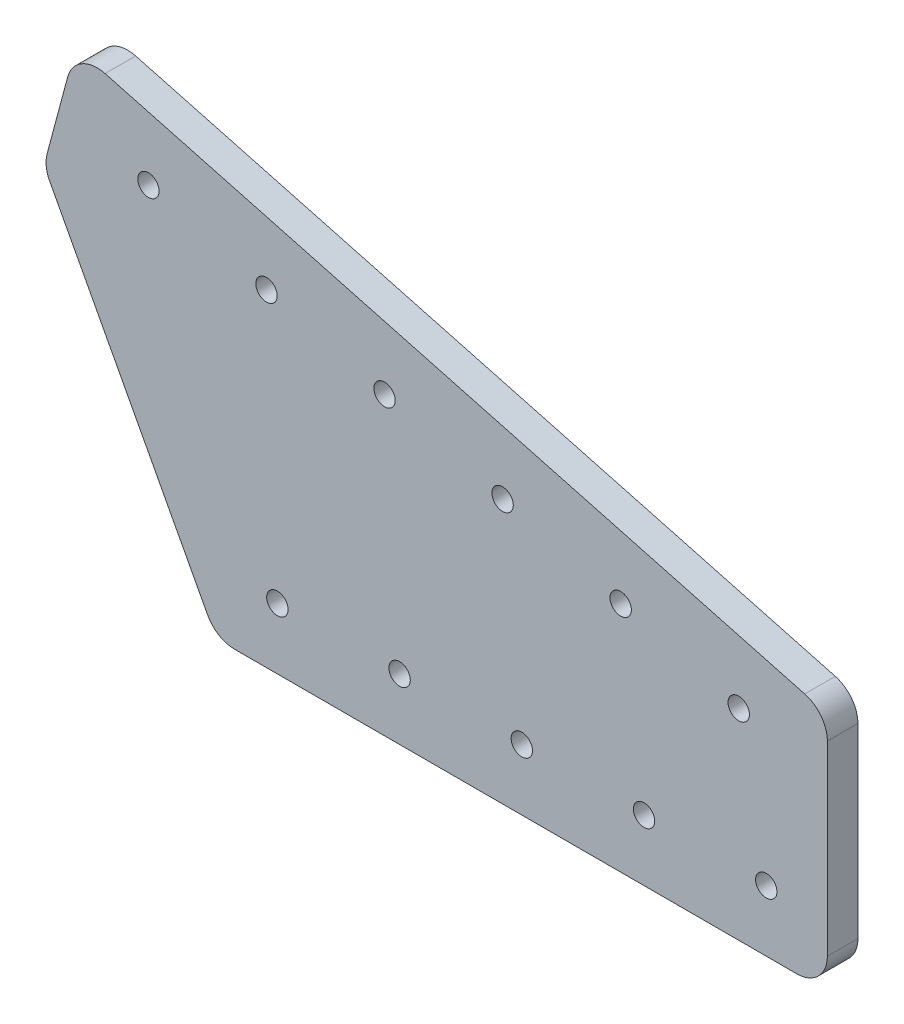
ISO-10303-21;
HEADER;
FILE_DESCRIPTION(('STEP AP214'),'2;1');
FILE_NAME('part.step','',(''),(''),'','','');
FILE_SCHEMA(('AUTOMOTIVE_DESIGN { 1 0 10303 214 1 1 1 1 }'));
ENDSEC;
DATA;
#1=APPLICATION_CONTEXT('core data for automotive mechanical design processes');
#2=APPLICATION_PROTOCOL_DEFINITION('international standard','automotive_design',2000,#1);
#3=PRODUCT_CONTEXT('',#1,'mechanical');
#4=PRODUCT('Part','Part','',(#3));
#5=PRODUCT_RELATED_PRODUCT_CATEGORY('part','',(#4));
#6=PRODUCT_DEFINITION_FORMATION('','',#4);
#7=PRODUCT_DEFINITION_CONTEXT('part definition',#1,'design');
#8=PRODUCT_DEFINITION('design','',#6,#7);
#9=PRODUCT_DEFINITION_SHAPE('','',#8);
#10=(LENGTH_UNIT() NAMED_UNIT(*) SI_UNIT(.MILLI.,.METRE.));
#11=(NAMED_UNIT(*) PLANE_ANGLE_UNIT() SI_UNIT($,.RADIAN.));
#12=(NAMED_UNIT(*) SI_UNIT($,.STERADIAN.) SOLID_ANGLE_UNIT());
#13=UNCERTAINTY_MEASURE_WITH_UNIT(LENGTH_MEASURE(1.E-05),#10,'distance_accuracy_value','');
#14=(GEOMETRIC_REPRESENTATION_CONTEXT(3) GLOBAL_UNCERTAINTY_ASSIGNED_CONTEXT((#13)) GLOBAL_UNIT_ASSIGNED_CONTEXT((#10,
#11,#12)) REPRESENTATION_CONTEXT('',''));
#15=CARTESIAN_POINT('',(0.,0.,0.));
#16=DIRECTION('',(0.,0.,1.));
#17=DIRECTION('',(1.,0.,0.));
#18=AXIS2_PLACEMENT_3D('',#15,#16,#17);
#19=CARTESIAN_POINT('',(200.,0.,10.));
#20=DIRECTION('',(0.,1.,0.));
#21=DIRECTION('',(-1.,0.,0.));
#22=AXIS2_PLACEMENT_3D('',#19,#20,#21);
#23=PLANE('',#22);
#24=DIRECTION('',(1.,0.,0.));
#25=VECTOR('',#24,1.);
#26=CARTESIAN_POINT('',(200.,0.,10.));
#27=LINE('',#26,#25);
#28=CARTESIAN_POINT('',(6.00519056041624,0.,10.));
#29=VERTEX_POINT('',#28);
#30=CARTESIAN_POINT('',(190.,0.,10.));
#31=VERTEX_POINT('',#30);
#32=EDGE_CURVE('E145',#29,#31,#27,.T.);
#33=ORIENTED_EDGE('',*,*,#32,.F.);
#34=DIRECTION('',(0.,0.,-1.));
#35=VECTOR('',#34,1.);
#36=CARTESIAN_POINT('',(6.00519056041624,0.,10.));
#37=LINE('',#36,#35);
#38=CARTESIAN_POINT('',(6.00519056041624,0.,0.));
#39=VERTEX_POINT('',#38);
#40=EDGE_CURVE('E130',#29,#39,#37,.T.);
#41=ORIENTED_EDGE('',*,*,#40,.T.);
#42=DIRECTION('',(1.,0.,0.));
#43=VECTOR('',#42,1.);
#44=CARTESIAN_POINT('',(200.,0.,0.));
#45=LINE('',#44,#43);
#46=CARTESIAN_POINT('',(190.,0.,0.));
#47=VERTEX_POINT('',#46);
#48=EDGE_CURVE('E142',#39,#47,#45,.T.);
#49=ORIENTED_EDGE('',*,*,#48,.T.);
#50=DIRECTION('',(0.,0.,-1.));
#51=VECTOR('',#50,1.);
#52=CARTESIAN_POINT('',(190.,0.,10.));
#53=LINE('',#52,#51);
#54=EDGE_CURVE('E147',#47,#31,#53,.F.);
#55=ORIENTED_EDGE('',*,*,#54,.T.);
#56=EDGE_LOOP('',(#33,#41,#49,#55));
#57=FACE_BOUND('',#56,.T.);
#58=ADVANCED_FACE('F48',(#57),#23,.F.);
#59=CARTESIAN_POINT('',(200.,78.6370330515628,10.));
#60=DIRECTION('',(-1.,0.,0.));
#61=DIRECTION('',(0.,0.,1.));
#62=AXIS2_PLACEMENT_3D('',#59,#60,#61);
#63=PLANE('',#62);
#64=DIRECTION('',(0.,1.,0.));
#65=VECTOR('',#64,1.);
#66=CARTESIAN_POINT('',(200.,78.6370330515628,10.));
#67=LINE('',#66,#65);
#68=CARTESIAN_POINT('',(200.,10.,10.));
#69=VERTEX_POINT('',#68);
#70=CARTESIAN_POINT('',(200.,70.9637631717731,10.));
#71=VERTEX_POINT('',#70);
#72=EDGE_CURVE('E215',#69,#71,#67,.T.);
#73=ORIENTED_EDGE('',*,*,#72,.F.);
#74=DIRECTION('',(0.,0.,-1.));
#75=VECTOR('',#74,1.);
#76=CARTESIAN_POINT('',(200.,10.,10.));
#77=LINE('',#76,#75);
#78=CARTESIAN_POINT('',(200.,10.,0.));
#79=VERTEX_POINT('',#78);
#80=EDGE_CURVE('E191',#69,#79,#77,.T.);
#81=ORIENTED_EDGE('',*,*,#80,.T.);
#82=DIRECTION('',(0.,1.,0.));
#83=VECTOR('',#82,1.);
#84=CARTESIAN_POINT('',(200.,78.6370330515628,0.));
#85=LINE('',#84,#83);
#86=CARTESIAN_POINT('',(200.,70.9637631717731,0.));
#87=VERTEX_POINT('',#86);
#88=EDGE_CURVE('E151',#79,#87,#85,.T.);
#89=ORIENTED_EDGE('',*,*,#88,.T.);
#90=DIRECTION('',(0.,0.,-1.));
#91=VECTOR('',#90,1.);
#92=CARTESIAN_POINT('',(200.,70.9637631717731,10.));
#93=LINE('',#92,#91);
#94=EDGE_CURVE('E189',#87,#71,#93,.F.);
#95=ORIENTED_EDGE('',*,*,#94,.T.);
#96=EDGE_LOOP('',(#73,#81,#89,#95));
#97=FACE_BOUND('',#96,.T.);
#98=ADVANCED_FACE('F298',(#97),#63,.F.);
#99=CARTESIAN_POINT('',(-46.0370066276877,144.562450285621,10.));
#100=DIRECTION('',(-0.258819045102515,-0.96592582628907,0.));
#101=DIRECTION('',(0.96592582628907,-0.258819045102515,0.));
#102=AXIS2_PLACEMENT_3D('',#99,#100,#101);
#103=PLANE('',#102);
#104=DIRECTION('',(-0.96592582628907,0.258819045102515,0.));
#105=VECTOR('',#104,1.);
#106=CARTESIAN_POINT('',(-46.0370066276877,144.562450285621,10.));
#107=LINE('',#106,#105);
#108=CARTESIAN_POINT('',(192.588190451025,80.6230214346638,10.));
#109=VERTEX_POINT('',#108);
#110=CARTESIAN_POINT('',(-36.377748364797,141.974259834596,10.));
#111=VERTEX_POINT('',#110);
#112=EDGE_CURVE('E204',#109,#111,#107,.T.);
#113=ORIENTED_EDGE('',*,*,#112,.F.);
#114=DIRECTION('',(0.,0.,-1.));
#115=VECTOR('',#114,1.);
#116=CARTESIAN_POINT('',(192.588190451025,80.6230214346638,10.));
#117=LINE('',#116,#115);
#118=CARTESIAN_POINT('',(192.588190451025,80.6230214346638,0.));
#119=VERTEX_POINT('',#118);
#120=EDGE_CURVE('E196',#109,#119,#117,.T.);
#121=ORIENTED_EDGE('',*,*,#120,.T.);
#122=DIRECTION('',(-0.96592582628907,0.258819045102515,0.));
#123=VECTOR('',#122,1.);
#124=CARTESIAN_POINT('',(-46.0370066276877,144.562450285621,0.));
#125=LINE('',#124,#123);
#126=CARTESIAN_POINT('',(-36.377748364797,141.974259834596,0.));
#127=VERTEX_POINT('',#126);
#128=EDGE_CURVE('E155',#119,#127,#125,.T.);
#129=ORIENTED_EDGE('',*,*,#128,.T.);
#130=DIRECTION('',(0.,0.,-1.));
#131=VECTOR('',#130,1.);
#132=CARTESIAN_POINT('',(-36.377748364797,141.974259834596,10.));
#133=LINE('',#132,#131);
#134=EDGE_CURVE('E194',#127,#111,#133,.F.);
#135=ORIENTED_EDGE('',*,*,#134,.T.);
#136=EDGE_LOOP('',(#113,#121,#129,#135));
#137=FACE_BOUND('',#136,.T.);
#138=ADVANCED_FACE('F202',(#137),#103,.F.);
#139=CARTESIAN_POINT('',(-56.3897684317884,105.925417234058,10.));
#140=DIRECTION('',(0.965925826289069,-0.258819045102518,0.));
#141=DIRECTION('',(0.258819045102518,0.965925826289069,0.));
#142=AXIS2_PLACEMENT_3D('',#139,#140,#141);
#143=PLANE('',#142);
#144=DIRECTION('',(-0.258819045102518,-0.965925826289069,0.));
#145=VECTOR('',#144,1.);
#146=CARTESIAN_POINT('',(-56.3897684317884,105.925417234058,10.));
#147=LINE('',#146,#145);
#148=CARTESIAN_POINT('',(-48.6251970787128,134.90319202273,10.));
#149=VERTEX_POINT('',#148);
#150=CARTESIAN_POINT('',(-55.3695025999747,109.733101155613,10.));
#151=VERTEX_POINT('',#150);
#152=EDGE_CURVE('E212',#149,#151,#147,.T.);
#153=ORIENTED_EDGE('',*,*,#152,.F.);
#154=DIRECTION('',(0.,0.,-1.));
#155=VECTOR('',#154,1.);
#156=CARTESIAN_POINT('',(-48.6251970787128,134.90319202273,10.));
#157=LINE('',#156,#155);
#158=CARTESIAN_POINT('',(-48.6251970787128,134.90319202273,0.));
#159=VERTEX_POINT('',#158);
#160=EDGE_CURVE('E12',#149,#159,#157,.T.);
#161=ORIENTED_EDGE('',*,*,#160,.T.);
#162=DIRECTION('',(-0.258819045102518,-0.965925826289069,0.));
#163=VECTOR('',#162,1.);
#164=CARTESIAN_POINT('',(-56.3897684317884,105.925417234058,0.));
#165=LINE('',#164,#163);
#166=CARTESIAN_POINT('',(-55.3695025999747,109.733101155613,0.));
#167=VERTEX_POINT('',#166);
#168=EDGE_CURVE('E166',#159,#167,#165,.T.);
#169=ORIENTED_EDGE('',*,*,#168,.T.);
#170=DIRECTION('',(0.,0.,-1.));
#171=VECTOR('',#170,1.);
#172=CARTESIAN_POINT('',(-55.3695025999747,109.733101155613,10.));
#173=LINE('',#172,#171);
#174=EDGE_CURVE('E56',#167,#151,#173,.F.);
#175=ORIENTED_EDGE('',*,*,#174,.T.);
#176=EDGE_LOOP('',(#153,#161,#169,#175));
#177=FACE_BOUND('',#176,.T.);
#178=ADVANCED_FACE('F211',(#177),#143,.F.);
#179=CARTESIAN_POINT('',(0.,0.,10.));
#180=DIRECTION('',(0.882711810283817,0.46991473693157,0.));
#181=DIRECTION('',(-0.46991473693157,0.882711810283817,0.));
#182=AXIS2_PLACEMENT_3D('',#179,#180,#181);
#183=PLANE('',#182);
#184=DIRECTION('',(0.46991473693157,-0.882711810283817,0.));
#185=VECTOR('',#184,1.);
#186=CARTESIAN_POINT('',(0.,0.,0.));
#187=LINE('',#186,#185);
#188=CARTESIAN_POINT('',(-54.5373624399222,102.445763335272,0.));
#189=VERTEX_POINT('',#188);
#190=CARTESIAN_POINT('',(-2.82192754242194,5.3008526306843,0.));
#191=VERTEX_POINT('',#190);
#192=EDGE_CURVE('E168',#189,#191,#187,.T.);
#193=ORIENTED_EDGE('',*,*,#192,.T.);
#194=DIRECTION('',(0.,0.,-1.));
#195=VECTOR('',#194,1.);
#196=CARTESIAN_POINT('',(-2.82192754242194,5.3008526306843,10.));
#197=LINE('',#196,#195);
#198=CARTESIAN_POINT('',(-2.82192754242194,5.3008526306843,10.));
#199=VERTEX_POINT('',#198);
#200=EDGE_CURVE('E131',#191,#199,#197,.F.);
#201=ORIENTED_EDGE('',*,*,#200,.T.);
#202=DIRECTION('',(0.46991473693157,-0.882711810283817,0.));
#203=VECTOR('',#202,1.);
#204=CARTESIAN_POINT('',(0.,0.,10.));
#205=LINE('',#204,#203);
#206=CARTESIAN_POINT('',(-54.5373624399222,102.445763335272,10.));
#207=VERTEX_POINT('',#206);
#208=EDGE_CURVE('E161',#207,#199,#205,.T.);
#209=ORIENTED_EDGE('',*,*,#208,.F.);
#210=DIRECTION('',(0.,0.,-1.));
#211=VECTOR('',#210,1.);
#212=CARTESIAN_POINT('',(-54.5373624399222,102.445763335272,10.));
#213=LINE('',#212,#211);
#214=EDGE_CURVE('E136',#207,#189,#213,.T.);
#215=ORIENTED_EDGE('',*,*,#214,.T.);
#216=EDGE_LOOP('',(#193,#201,#209,#215));
#217=FACE_BOUND('',#216,.T.);
#218=ADVANCED_FACE('F331',(#217),#183,.F.);
#219=CARTESIAN_POINT('',(0.,0.,10.));
#220=DIRECTION('',(0.,0.,1.));
#221=DIRECTION('',(1.,0.,0.));
#222=AXIS2_PLACEMENT_3D('',#219,#220,#221);
#223=PLANE('',#222);
#224=CARTESIAN_POINT('',(16.4377566577868,107.116864307751,10.));
#225=DIRECTION('',(0.,0.,1.));
#226=DIRECTION('',(1.,0.,0.));
#227=AXIS2_PLACEMENT_3D('',#224,#225,#226);
#228=CIRCLE('',#227,3.5);
#229=CARTESIAN_POINT('',(19.9377566577868,107.116864307751,10.));
#230=VERTEX_POINT('',#229);
#231=EDGE_CURVE('E223',#230,#230,#228,.T.);
#232=ORIENTED_EDGE('',*,*,#231,.F.);
#233=EDGE_LOOP('',(#232));
#234=FACE_BOUND('',#233,.T.);
#235=CARTESIAN_POINT('',(55.0747897093496,96.7641025036506,10.));
#236=DIRECTION('',(0.,0.,1.));
#237=DIRECTION('',(1.,0.,0.));
#238=AXIS2_PLACEMENT_3D('',#235,#236,#237);
#239=CIRCLE('',#238,3.5);
#240=CARTESIAN_POINT('',(58.5747897093496,96.7641025036506,10.));
#241=VERTEX_POINT('',#240);
#242=EDGE_CURVE('E226',#241,#241,#239,.T.);
#243=ORIENTED_EDGE('',*,*,#242,.F.);
#244=EDGE_LOOP('',(#243));
#245=FACE_BOUND('',#244,.T.);
#246=CARTESIAN_POINT('',(93.7118227609124,86.41134069955,10.));
#247=DIRECTION('',(0.,0.,1.));
#248=DIRECTION('',(1.,0.,0.));
#249=AXIS2_PLACEMENT_3D('',#246,#247,#248);
#250=CIRCLE('',#249,3.5);
#251=CARTESIAN_POINT('',(97.2118227609124,86.41134069955,10.));
#252=VERTEX_POINT('',#251);
#253=EDGE_CURVE('E229',#252,#252,#250,.T.);
#254=ORIENTED_EDGE('',*,*,#253,.F.);
#255=EDGE_LOOP('',(#254));
#256=FACE_BOUND('',#255,.T.);
#257=CARTESIAN_POINT('',(132.348855812475,76.0585788954492,10.));
#258=DIRECTION('',(0.,0.,1.));
#259=DIRECTION('',(1.,0.,0.));
#260=AXIS2_PLACEMENT_3D('',#257,#258,#259);
#261=CIRCLE('',#260,3.5);
#262=CARTESIAN_POINT('',(135.848855812475,76.0585788954492,10.));
#263=VERTEX_POINT('',#262);
#264=EDGE_CURVE('E232',#263,#263,#261,.T.);
#265=ORIENTED_EDGE('',*,*,#264,.F.);
#266=EDGE_LOOP('',(#265));
#267=FACE_BOUND('',#266,.T.);
#268=CARTESIAN_POINT('',(170.985888864038,65.7058170913485,10.));
#269=DIRECTION('',(0.,0.,1.));
#270=DIRECTION('',(1.,0.,0.));
#271=AXIS2_PLACEMENT_3D('',#268,#269,#270);
#272=CIRCLE('',#271,3.5);
#273=CARTESIAN_POINT('',(174.485888864038,65.7058170913485,10.));
#274=VERTEX_POINT('',#273);
#275=EDGE_CURVE('E235',#274,#274,#272,.T.);
#276=ORIENTED_EDGE('',*,*,#275,.F.);
#277=EDGE_LOOP('',(#276));
#278=FACE_BOUND('',#277,.T.);
#279=CARTESIAN_POINT('',(20.,20.,10.));
#280=DIRECTION('',(0.,0.,1.));
#281=DIRECTION('',(1.,0.,0.));
#282=AXIS2_PLACEMENT_3D('',#279,#280,#281);
#283=CIRCLE('',#282,3.5);
#284=CARTESIAN_POINT('',(23.5,20.,10.));
#285=VERTEX_POINT('',#284);
#286=EDGE_CURVE('E238',#285,#285,#283,.T.);
#287=ORIENTED_EDGE('',*,*,#286,.F.);
#288=EDGE_LOOP('',(#287));
#289=FACE_BOUND('',#288,.T.);
#290=CARTESIAN_POINT('',(60.,20.,10.));
#291=DIRECTION('',(0.,0.,1.));
#292=DIRECTION('',(1.,0.,0.));
#293=AXIS2_PLACEMENT_3D('',#290,#291,#292);
#294=CIRCLE('',#293,3.5);
#295=CARTESIAN_POINT('',(63.5,20.,10.));
#296=VERTEX_POINT('',#295);
#297=EDGE_CURVE('E241',#296,#296,#294,.T.);
#298=ORIENTED_EDGE('',*,*,#297,.F.);
#299=EDGE_LOOP('',(#298));
#300=FACE_BOUND('',#299,.T.);
#301=CARTESIAN_POINT('',(100.,20.,10.));
#302=DIRECTION('',(0.,0.,1.));
#303=DIRECTION('',(1.,0.,0.));
#304=AXIS2_PLACEMENT_3D('',#301,#302,#303);
#305=CIRCLE('',#304,3.50000000000001);
#306=CARTESIAN_POINT('',(103.5,20.,10.));
#307=VERTEX_POINT('',#306);
#308=EDGE_CURVE('E244',#307,#307,#305,.T.);
#309=ORIENTED_EDGE('',*,*,#308,.F.);
#310=EDGE_LOOP('',(#309));
#311=FACE_BOUND('',#310,.T.);
#312=CARTESIAN_POINT('',(180.,20.,10.));
#313=DIRECTION('',(0.,0.,1.));
#314=DIRECTION('',(1.,0.,0.));
#315=AXIS2_PLACEMENT_3D('',#312,#313,#314);
#316=CIRCLE('',#315,3.49999999999999);
#317=CARTESIAN_POINT('',(183.5,20.,10.));
#318=VERTEX_POINT('',#317);
#319=EDGE_CURVE('E247',#318,#318,#316,.T.);
#320=ORIENTED_EDGE('',*,*,#319,.F.);
#321=EDGE_LOOP('',(#320));
#322=FACE_BOUND('',#321,.T.);
#323=CARTESIAN_POINT('',(140.,20.,10.));
#324=DIRECTION('',(0.,0.,1.));
#325=DIRECTION('',(1.,0.,0.));
#326=AXIS2_PLACEMENT_3D('',#323,#324,#325);
#327=CIRCLE('',#326,3.49999999999999);
#328=CARTESIAN_POINT('',(143.5,20.,10.));
#329=VERTEX_POINT('',#328);
#330=EDGE_CURVE('E250',#329,#329,#327,.T.);
#331=ORIENTED_EDGE('',*,*,#330,.F.);
#332=EDGE_LOOP('',(#331));
#333=FACE_BOUND('',#332,.T.);
#334=CARTESIAN_POINT('',(-22.199276393776,117.469626111852,10.));
#335=DIRECTION('',(0.,0.,1.));
#336=DIRECTION('',(1.,0.,0.));
#337=AXIS2_PLACEMENT_3D('',#334,#335,#336);
#338=CIRCLE('',#337,3.5);
#339=CARTESIAN_POINT('',(-18.699276393776,117.469626111852,10.));
#340=VERTEX_POINT('',#339);
#341=EDGE_CURVE('E152',#340,#340,#338,.T.);
#342=ORIENTED_EDGE('',*,*,#341,.F.);
#343=EDGE_LOOP('',(#342));
#344=FACE_BOUND('',#343,.T.);
#345=ORIENTED_EDGE('',*,*,#208,.T.);
#346=CARTESIAN_POINT('',(6.00519056041624,10.,10.));
#347=DIRECTION('',(0.,0.,1.));
#348=DIRECTION('',(1.,0.,0.));
#349=AXIS2_PLACEMENT_3D('',#346,#347,#348);
#350=CIRCLE('',#349,10.);
#351=EDGE_CURVE('E187',#199,#29,#350,.T.);
#352=ORIENTED_EDGE('',*,*,#351,.T.);
#353=ORIENTED_EDGE('',*,*,#32,.T.);
#354=CARTESIAN_POINT('',(190.,10.,10.));
#355=DIRECTION('',(0.,0.,1.));
#356=DIRECTION('',(1.,0.,0.));
#357=AXIS2_PLACEMENT_3D('',#354,#355,#356);
#358=CIRCLE('',#357,10.);
#359=EDGE_CURVE('E185',#31,#69,#358,.T.);
#360=ORIENTED_EDGE('',*,*,#359,.T.);
#361=ORIENTED_EDGE('',*,*,#72,.T.);
#362=CARTESIAN_POINT('',(190.,70.9637631717731,10.));
#363=DIRECTION('',(0.,0.,1.));
#364=DIRECTION('',(1.,0.,0.));
#365=AXIS2_PLACEMENT_3D('',#362,#363,#364);
#366=CIRCLE('',#365,10.);
#367=EDGE_CURVE('E183',#71,#109,#366,.T.);
#368=ORIENTED_EDGE('',*,*,#367,.T.);
#369=ORIENTED_EDGE('',*,*,#112,.T.);
#370=CARTESIAN_POINT('',(-38.9659388158221,132.315001571705,10.));
#371=DIRECTION('',(0.,0.,1.));
#372=DIRECTION('',(1.,0.,0.));
#373=AXIS2_PLACEMENT_3D('',#370,#371,#372);
#374=CIRCLE('',#373,10.);
#375=EDGE_CURVE('E69',#111,#149,#374,.T.);
#376=ORIENTED_EDGE('',*,*,#375,.T.);
#377=ORIENTED_EDGE('',*,*,#152,.T.);
#378=CARTESIAN_POINT('',(-45.710244337084,107.144910704588,10.));
#379=DIRECTION('',(0.,0.,1.));
#380=DIRECTION('',(1.,0.,0.));
#381=AXIS2_PLACEMENT_3D('',#378,#379,#380);
#382=CIRCLE('',#381,10.);
#383=EDGE_CURVE('E180',#151,#207,#382,.T.);
#384=ORIENTED_EDGE('',*,*,#383,.T.);
#385=EDGE_LOOP('',(#345,#352,#353,#360,#361,#368,#369,#376,#377,#384));
#386=FACE_BOUND('',#385,.T.);
#387=ADVANCED_FACE('F329',(#234,#245,#256,#267,#278,#289,#300,#311,#322,#333,#344,#386),#223,.T.);
#388=CARTESIAN_POINT('',(0.,0.,0.));
#389=DIRECTION('',(0.,0.,1.));
#390=DIRECTION('',(1.,0.,0.));
#391=AXIS2_PLACEMENT_3D('',#388,#389,#390);
#392=PLANE('',#391);
#393=CARTESIAN_POINT('',(16.4377566577868,107.116864307751,0.));
#394=DIRECTION('',(0.,0.,1.));
#395=DIRECTION('',(1.,0.,0.));
#396=AXIS2_PLACEMENT_3D('',#393,#394,#395);
#397=CIRCLE('',#396,3.5);
#398=CARTESIAN_POINT('',(19.9377566577868,107.116864307751,0.));
#399=VERTEX_POINT('',#398);
#400=EDGE_CURVE('E253',#399,#399,#397,.T.);
#401=ORIENTED_EDGE('',*,*,#400,.T.);
#402=EDGE_LOOP('',(#401));
#403=FACE_BOUND('',#402,.T.);
#404=CARTESIAN_POINT('',(55.0747897093496,96.7641025036506,0.));
#405=DIRECTION('',(0.,0.,1.));
#406=DIRECTION('',(1.,0.,0.));
#407=AXIS2_PLACEMENT_3D('',#404,#405,#406);
#408=CIRCLE('',#407,3.5);
#409=CARTESIAN_POINT('',(58.5747897093496,96.7641025036506,0.));
#410=VERTEX_POINT('',#409);
#411=EDGE_CURVE('E278',#410,#410,#408,.T.);
#412=ORIENTED_EDGE('',*,*,#411,.T.);
#413=EDGE_LOOP('',(#412));
#414=FACE_BOUND('',#413,.T.);
#415=CARTESIAN_POINT('',(93.7118227609124,86.41134069955,0.));
#416=DIRECTION('',(0.,0.,1.));
#417=DIRECTION('',(-1.,0.,0.));
#418=AXIS2_PLACEMENT_3D('',#415,#416,#417);
#419=CIRCLE('',#418,3.5);
#420=CARTESIAN_POINT('',(90.2118227609124,86.41134069955,0.));
#421=VERTEX_POINT('',#420);
#422=EDGE_CURVE('E275',#421,#421,#419,.T.);
#423=ORIENTED_EDGE('',*,*,#422,.T.);
#424=EDGE_LOOP('',(#423));
#425=FACE_BOUND('',#424,.T.);
#426=CARTESIAN_POINT('',(132.348855812475,76.0585788954492,0.));
#427=DIRECTION('',(0.,0.,1.));
#428=DIRECTION('',(-1.,0.,0.));
#429=AXIS2_PLACEMENT_3D('',#426,#427,#428);
#430=CIRCLE('',#429,3.5);
#431=CARTESIAN_POINT('',(128.848855812475,76.0585788954492,0.));
#432=VERTEX_POINT('',#431);
#433=EDGE_CURVE('E272',#432,#432,#430,.T.);
#434=ORIENTED_EDGE('',*,*,#433,.T.);
#435=EDGE_LOOP('',(#434));
#436=FACE_BOUND('',#435,.T.);
#437=CARTESIAN_POINT('',(170.985888864038,65.7058170913485,0.));
#438=DIRECTION('',(0.,0.,1.));
#439=DIRECTION('',(-1.,0.,0.));
#440=AXIS2_PLACEMENT_3D('',#437,#438,#439);
#441=CIRCLE('',#440,3.5);
#442=CARTESIAN_POINT('',(167.485888864038,65.7058170913485,0.));
#443=VERTEX_POINT('',#442);
#444=EDGE_CURVE('E269',#443,#443,#441,.T.);
#445=ORIENTED_EDGE('',*,*,#444,.T.);
#446=EDGE_LOOP('',(#445));
#447=FACE_BOUND('',#446,.T.);
#448=CARTESIAN_POINT('',(20.,20.,0.));
#449=DIRECTION('',(0.,0.,1.));
#450=DIRECTION('',(1.,0.,0.));
#451=AXIS2_PLACEMENT_3D('',#448,#449,#450);
#452=CIRCLE('',#451,3.5);
#453=CARTESIAN_POINT('',(23.5,20.,0.));
#454=VERTEX_POINT('',#453);
#455=EDGE_CURVE('E266',#454,#454,#452,.T.);
#456=ORIENTED_EDGE('',*,*,#455,.T.);
#457=EDGE_LOOP('',(#456));
#458=FACE_BOUND('',#457,.T.);
#459=CARTESIAN_POINT('',(60.,20.,0.));
#460=DIRECTION('',(0.,0.,1.));
#461=DIRECTION('',(1.,0.,0.));
#462=AXIS2_PLACEMENT_3D('',#459,#460,#461);
#463=CIRCLE('',#462,3.5);
#464=CARTESIAN_POINT('',(63.5,20.,0.));
#465=VERTEX_POINT('',#464);
#466=EDGE_CURVE('E263',#465,#465,#463,.T.);
#467=ORIENTED_EDGE('',*,*,#466,.T.);
#468=EDGE_LOOP('',(#467));
#469=FACE_BOUND('',#468,.T.);
#470=CARTESIAN_POINT('',(100.,20.,0.));
#471=DIRECTION('',(0.,0.,1.));
#472=DIRECTION('',(1.,0.,0.));
#473=AXIS2_PLACEMENT_3D('',#470,#471,#472);
#474=CIRCLE('',#473,3.50000000000001);
#475=CARTESIAN_POINT('',(103.5,20.,0.));
#476=VERTEX_POINT('',#475);
#477=EDGE_CURVE('E260',#476,#476,#474,.T.);
#478=ORIENTED_EDGE('',*,*,#477,.T.);
#479=EDGE_LOOP('',(#478));
#480=FACE_BOUND('',#479,.T.);
#481=CARTESIAN_POINT('',(180.,20.,0.));
#482=DIRECTION('',(0.,0.,1.));
#483=DIRECTION('',(-1.,0.,0.));
#484=AXIS2_PLACEMENT_3D('',#481,#482,#483);
#485=CIRCLE('',#484,3.49999999999999);
#486=CARTESIAN_POINT('',(176.5,20.,0.));
#487=VERTEX_POINT('',#486);
#488=EDGE_CURVE('E257',#487,#487,#485,.T.);
#489=ORIENTED_EDGE('',*,*,#488,.T.);
#490=EDGE_LOOP('',(#489));
#491=FACE_BOUND('',#490,.T.);
#492=CARTESIAN_POINT('',(140.,20.,0.));
#493=DIRECTION('',(0.,0.,1.));
#494=DIRECTION('',(-1.,0.,0.));
#495=AXIS2_PLACEMENT_3D('',#492,#493,#494);
#496=CIRCLE('',#495,3.49999999999999);
#497=CARTESIAN_POINT('',(136.5,20.,0.));
#498=VERTEX_POINT('',#497);
#499=EDGE_CURVE('E254',#498,#498,#496,.T.);
#500=ORIENTED_EDGE('',*,*,#499,.T.);
#501=EDGE_LOOP('',(#500));
#502=FACE_BOUND('',#501,.T.);
#503=CARTESIAN_POINT('',(-22.199276393776,117.469626111852,0.));
#504=DIRECTION('',(0.,0.,1.));
#505=DIRECTION('',(1.,0.,0.));
#506=AXIS2_PLACEMENT_3D('',#503,#504,#505);
#507=CIRCLE('',#506,3.5);
#508=CARTESIAN_POINT('',(-18.699276393776,117.469626111852,0.));
#509=VERTEX_POINT('',#508);
#510=EDGE_CURVE('E158',#509,#509,#507,.T.);
#511=ORIENTED_EDGE('',*,*,#510,.T.);
#512=EDGE_LOOP('',(#511));
#513=FACE_BOUND('',#512,.T.);
#514=ORIENTED_EDGE('',*,*,#48,.F.);
#515=CARTESIAN_POINT('',(6.00519056041624,10.,0.));
#516=DIRECTION('',(0.,0.,1.));
#517=DIRECTION('',(1.,0.,0.));
#518=AXIS2_PLACEMENT_3D('',#515,#516,#517);
#519=CIRCLE('',#518,10.);
#520=EDGE_CURVE('E126',#39,#191,#519,.F.);
#521=ORIENTED_EDGE('',*,*,#520,.T.);
#522=ORIENTED_EDGE('',*,*,#192,.F.);
#523=CARTESIAN_POINT('',(-45.710244337084,107.144910704588,0.));
#524=DIRECTION('',(0.,0.,1.));
#525=DIRECTION('',(1.,0.,0.));
#526=AXIS2_PLACEMENT_3D('',#523,#524,#525);
#527=CIRCLE('',#526,10.);
#528=EDGE_CURVE('E146',#189,#167,#527,.F.);
#529=ORIENTED_EDGE('',*,*,#528,.T.);
#530=ORIENTED_EDGE('',*,*,#168,.F.);
#531=CARTESIAN_POINT('',(-38.9659388158221,132.315001571705,0.));
#532=DIRECTION('',(0.,0.,1.));
#533=DIRECTION('',(1.,0.,0.));
#534=AXIS2_PLACEMENT_3D('',#531,#532,#533);
#535=CIRCLE('',#534,10.);
#536=EDGE_CURVE('E172',#159,#127,#535,.F.);
#537=ORIENTED_EDGE('',*,*,#536,.T.);
#538=ORIENTED_EDGE('',*,*,#128,.F.);
#539=CARTESIAN_POINT('',(190.,70.9637631717731,0.));
#540=DIRECTION('',(0.,0.,1.));
#541=DIRECTION('',(1.,0.,0.));
#542=AXIS2_PLACEMENT_3D('',#539,#540,#541);
#543=CIRCLE('',#542,10.);
#544=EDGE_CURVE('E174',#119,#87,#543,.F.);
#545=ORIENTED_EDGE('',*,*,#544,.T.);
#546=ORIENTED_EDGE('',*,*,#88,.F.);
#547=CARTESIAN_POINT('',(190.,10.,0.));
#548=DIRECTION('',(0.,0.,1.));
#549=DIRECTION('',(1.,0.,0.));
#550=AXIS2_PLACEMENT_3D('',#547,#548,#549);
#551=CIRCLE('',#550,10.);
#552=EDGE_CURVE('E137',#79,#47,#551,.F.);
#553=ORIENTED_EDGE('',*,*,#552,.T.);
#554=EDGE_LOOP('',(#514,#521,#522,#529,#530,#537,#538,#545,#546,#553));
#555=FACE_BOUND('',#554,.T.);
#556=ADVANCED_FACE('F149',(#403,#414,#425,#436,#447,#458,#469,#480,#491,#502,#513,#555),#392,.F.);
#557=CARTESIAN_POINT('',(6.00519056041624,10.,10.));
#558=DIRECTION('',(0.,0.,-1.));
#559=DIRECTION('',(-1.,0.,0.));
#560=AXIS2_PLACEMENT_3D('',#557,#558,#559);
#561=CYLINDRICAL_SURFACE('',#560,10.);
#562=ORIENTED_EDGE('',*,*,#351,.F.);
#563=ORIENTED_EDGE('',*,*,#200,.F.);
#564=ORIENTED_EDGE('',*,*,#520,.F.);
#565=ORIENTED_EDGE('',*,*,#40,.F.);
#566=EDGE_LOOP('',(#562,#563,#564,#565));
#567=FACE_BOUND('',#566,.T.);
#568=ADVANCED_FACE('F129',(#567),#561,.T.);
#569=CARTESIAN_POINT('',(190.,10.,10.));
#570=DIRECTION('',(0.,0.,-1.));
#571=DIRECTION('',(-1.,0.,0.));
#572=AXIS2_PLACEMENT_3D('',#569,#570,#571);
#573=CYLINDRICAL_SURFACE('',#572,10.);
#574=ORIENTED_EDGE('',*,*,#359,.F.);
#575=ORIENTED_EDGE('',*,*,#54,.F.);
#576=ORIENTED_EDGE('',*,*,#552,.F.);
#577=ORIENTED_EDGE('',*,*,#80,.F.);
#578=EDGE_LOOP('',(#574,#575,#576,#577));
#579=FACE_BOUND('',#578,.T.);
#580=ADVANCED_FACE('F309',(#579),#573,.T.);
#581=CARTESIAN_POINT('',(190.,70.9637631717731,10.));
#582=DIRECTION('',(0.,0.,-1.));
#583=DIRECTION('',(-1.,0.,0.));
#584=AXIS2_PLACEMENT_3D('',#581,#582,#583);
#585=CYLINDRICAL_SURFACE('',#584,10.);
#586=ORIENTED_EDGE('',*,*,#367,.F.);
#587=ORIENTED_EDGE('',*,*,#94,.F.);
#588=ORIENTED_EDGE('',*,*,#544,.F.);
#589=ORIENTED_EDGE('',*,*,#120,.F.);
#590=EDGE_LOOP('',(#586,#587,#588,#589));
#591=FACE_BOUND('',#590,.T.);
#592=ADVANCED_FACE('F312',(#591),#585,.T.);
#593=CARTESIAN_POINT('',(-38.9659388158221,132.315001571705,10.));
#594=DIRECTION('',(0.,0.,-1.));
#595=DIRECTION('',(-1.,0.,0.));
#596=AXIS2_PLACEMENT_3D('',#593,#594,#595);
#597=CYLINDRICAL_SURFACE('',#596,10.);
#598=ORIENTED_EDGE('',*,*,#375,.F.);
#599=ORIENTED_EDGE('',*,*,#134,.F.);
#600=ORIENTED_EDGE('',*,*,#536,.F.);
#601=ORIENTED_EDGE('',*,*,#160,.F.);
#602=EDGE_LOOP('',(#598,#599,#600,#601));
#603=FACE_BOUND('',#602,.T.);
#604=ADVANCED_FACE('F210',(#603),#597,.T.);
#605=CARTESIAN_POINT('',(-45.710244337084,107.144910704588,10.));
#606=DIRECTION('',(0.,0.,-1.));
#607=DIRECTION('',(-1.,0.,0.));
#608=AXIS2_PLACEMENT_3D('',#605,#606,#607);
#609=CYLINDRICAL_SURFACE('',#608,10.);
#610=ORIENTED_EDGE('',*,*,#383,.F.);
#611=ORIENTED_EDGE('',*,*,#174,.F.);
#612=ORIENTED_EDGE('',*,*,#528,.F.);
#613=ORIENTED_EDGE('',*,*,#214,.F.);
#614=EDGE_LOOP('',(#610,#611,#612,#613));
#615=FACE_BOUND('',#614,.T.);
#616=ADVANCED_FACE('F50',(#615),#609,.T.);
#617=CARTESIAN_POINT('',(-22.199276393776,117.469626111852,0.));
#618=DIRECTION('',(0.,0.,1.));
#619=DIRECTION('',(1.,0.,0.));
#620=AXIS2_PLACEMENT_3D('',#617,#618,#619);
#621=CYLINDRICAL_SURFACE('',#620,3.5);
#622=ORIENTED_EDGE('',*,*,#341,.T.);
#623=EDGE_LOOP('',(#622));
#624=FACE_BOUND('',#623,.T.);
#625=ORIENTED_EDGE('',*,*,#510,.F.);
#626=EDGE_LOOP('',(#625));
#627=FACE_BOUND('',#626,.T.);
#628=ADVANCED_FACE('F319',(#624,#627),#621,.F.);
#629=CARTESIAN_POINT('',(140.,20.,0.));
#630=DIRECTION('',(0.,0.,1.));
#631=DIRECTION('',(1.,0.,0.));
#632=AXIS2_PLACEMENT_3D('',#629,#630,#631);
#633=CYLINDRICAL_SURFACE('',#632,3.49999999999999);
#634=ORIENTED_EDGE('',*,*,#330,.T.);
#635=EDGE_LOOP('',(#634));
#636=FACE_BOUND('',#635,.T.);
#637=ORIENTED_EDGE('',*,*,#499,.F.);
#638=EDGE_LOOP('',(#637));
#639=FACE_BOUND('',#638,.T.);
#640=ADVANCED_FACE('F324',(#636,#639),#633,.F.);
#641=CARTESIAN_POINT('',(180.,20.,0.));
#642=DIRECTION('',(0.,0.,1.));
#643=DIRECTION('',(1.,0.,0.));
#644=AXIS2_PLACEMENT_3D('',#641,#642,#643);
#645=CYLINDRICAL_SURFACE('',#644,3.49999999999999);
#646=ORIENTED_EDGE('',*,*,#319,.T.);
#647=EDGE_LOOP('',(#646));
#648=FACE_BOUND('',#647,.T.);
#649=ORIENTED_EDGE('',*,*,#488,.F.);
#650=EDGE_LOOP('',(#649));
#651=FACE_BOUND('',#650,.T.);
#652=ADVANCED_FACE('F409',(#648,#651),#645,.F.);
#653=CARTESIAN_POINT('',(100.,20.,0.));
#654=DIRECTION('',(0.,0.,1.));
#655=DIRECTION('',(1.,0.,0.));
#656=AXIS2_PLACEMENT_3D('',#653,#654,#655);
#657=CYLINDRICAL_SURFACE('',#656,3.50000000000001);
#658=ORIENTED_EDGE('',*,*,#308,.T.);
#659=EDGE_LOOP('',(#658));
#660=FACE_BOUND('',#659,.T.);
#661=ORIENTED_EDGE('',*,*,#477,.F.);
#662=EDGE_LOOP('',(#661));
#663=FACE_BOUND('',#662,.T.);
#664=ADVANCED_FACE('F419',(#660,#663),#657,.F.);
#665=CARTESIAN_POINT('',(60.,20.,0.));
#666=DIRECTION('',(0.,0.,1.));
#667=DIRECTION('',(1.,0.,0.));
#668=AXIS2_PLACEMENT_3D('',#665,#666,#667);
#669=CYLINDRICAL_SURFACE('',#668,3.5);
#670=ORIENTED_EDGE('',*,*,#297,.T.);
#671=EDGE_LOOP('',(#670));
#672=FACE_BOUND('',#671,.T.);
#673=ORIENTED_EDGE('',*,*,#466,.F.);
#674=EDGE_LOOP('',(#673));
#675=FACE_BOUND('',#674,.T.);
#676=ADVANCED_FACE('F429',(#672,#675),#669,.F.);
#677=CARTESIAN_POINT('',(20.,20.,0.));
#678=DIRECTION('',(0.,0.,1.));
#679=DIRECTION('',(1.,0.,0.));
#680=AXIS2_PLACEMENT_3D('',#677,#678,#679);
#681=CYLINDRICAL_SURFACE('',#680,3.5);
#682=ORIENTED_EDGE('',*,*,#286,.T.);
#683=EDGE_LOOP('',(#682));
#684=FACE_BOUND('',#683,.T.);
#685=ORIENTED_EDGE('',*,*,#455,.F.);
#686=EDGE_LOOP('',(#685));
#687=FACE_BOUND('',#686,.T.);
#688=ADVANCED_FACE('F439',(#684,#687),#681,.F.);
#689=CARTESIAN_POINT('',(170.985888864038,65.7058170913485,0.));
#690=DIRECTION('',(0.,0.,1.));
#691=DIRECTION('',(1.,0.,0.));
#692=AXIS2_PLACEMENT_3D('',#689,#690,#691);
#693=CYLINDRICAL_SURFACE('',#692,3.5);
#694=ORIENTED_EDGE('',*,*,#275,.T.);
#695=EDGE_LOOP('',(#694));
#696=FACE_BOUND('',#695,.T.);
#697=ORIENTED_EDGE('',*,*,#444,.F.);
#698=EDGE_LOOP('',(#697));
#699=FACE_BOUND('',#698,.T.);
#700=ADVANCED_FACE('F449',(#696,#699),#693,.F.);
#701=CARTESIAN_POINT('',(132.348855812475,76.0585788954492,0.));
#702=DIRECTION('',(0.,0.,1.));
#703=DIRECTION('',(1.,0.,0.));
#704=AXIS2_PLACEMENT_3D('',#701,#702,#703);
#705=CYLINDRICAL_SURFACE('',#704,3.5);
#706=ORIENTED_EDGE('',*,*,#264,.T.);
#707=EDGE_LOOP('',(#706));
#708=FACE_BOUND('',#707,.T.);
#709=ORIENTED_EDGE('',*,*,#433,.F.);
#710=EDGE_LOOP('',(#709));
#711=FACE_BOUND('',#710,.T.);
#712=ADVANCED_FACE('F459',(#708,#711),#705,.F.);
#713=CARTESIAN_POINT('',(93.7118227609124,86.41134069955,0.));
#714=DIRECTION('',(0.,0.,1.));
#715=DIRECTION('',(1.,0.,0.));
#716=AXIS2_PLACEMENT_3D('',#713,#714,#715);
#717=CYLINDRICAL_SURFACE('',#716,3.5);
#718=ORIENTED_EDGE('',*,*,#253,.T.);
#719=EDGE_LOOP('',(#718));
#720=FACE_BOUND('',#719,.T.);
#721=ORIENTED_EDGE('',*,*,#422,.F.);
#722=EDGE_LOOP('',(#721));
#723=FACE_BOUND('',#722,.T.);
#724=ADVANCED_FACE('F294',(#720,#723),#717,.F.);
#725=CARTESIAN_POINT('',(55.0747897093496,96.7641025036506,0.));
#726=DIRECTION('',(0.,0.,1.));
#727=DIRECTION('',(1.,0.,0.));
#728=AXIS2_PLACEMENT_3D('',#725,#726,#727);
#729=CYLINDRICAL_SURFACE('',#728,3.5);
#730=ORIENTED_EDGE('',*,*,#242,.T.);
#731=EDGE_LOOP('',(#730));
#732=FACE_BOUND('',#731,.T.);
#733=ORIENTED_EDGE('',*,*,#411,.F.);
#734=EDGE_LOOP('',(#733));
#735=FACE_BOUND('',#734,.T.);
#736=ADVANCED_FACE('F288',(#732,#735),#729,.F.);
#737=CARTESIAN_POINT('',(16.4377566577868,107.116864307751,0.));
#738=DIRECTION('',(0.,0.,1.));
#739=DIRECTION('',(1.,0.,0.));
#740=AXIS2_PLACEMENT_3D('',#737,#738,#739);
#741=CYLINDRICAL_SURFACE('',#740,3.5);
#742=ORIENTED_EDGE('',*,*,#231,.T.);
#743=EDGE_LOOP('',(#742));
#744=FACE_BOUND('',#743,.T.);
#745=ORIENTED_EDGE('',*,*,#400,.F.);
#746=EDGE_LOOP('',(#745));
#747=FACE_BOUND('',#746,.T.);
#748=ADVANCED_FACE('F286',(#744,#747),#741,.F.);
#749=CLOSED_SHELL('',(#58,#98,#138,#178,#218,#387,#556,#568,#580,#592,#604,#616,#628,#640,#652,
#664,#676,#688,#700,#712,#724,#736,#748));
#750=MANIFOLD_SOLID_BREP('B2',#749);
#751=ADVANCED_BREP_SHAPE_REPRESENTATION('',(#18,#750),#14);
#752=SHAPE_DEFINITION_REPRESENTATION(#9,#751);
ENDSEC;
END-ISO-10303-21;
